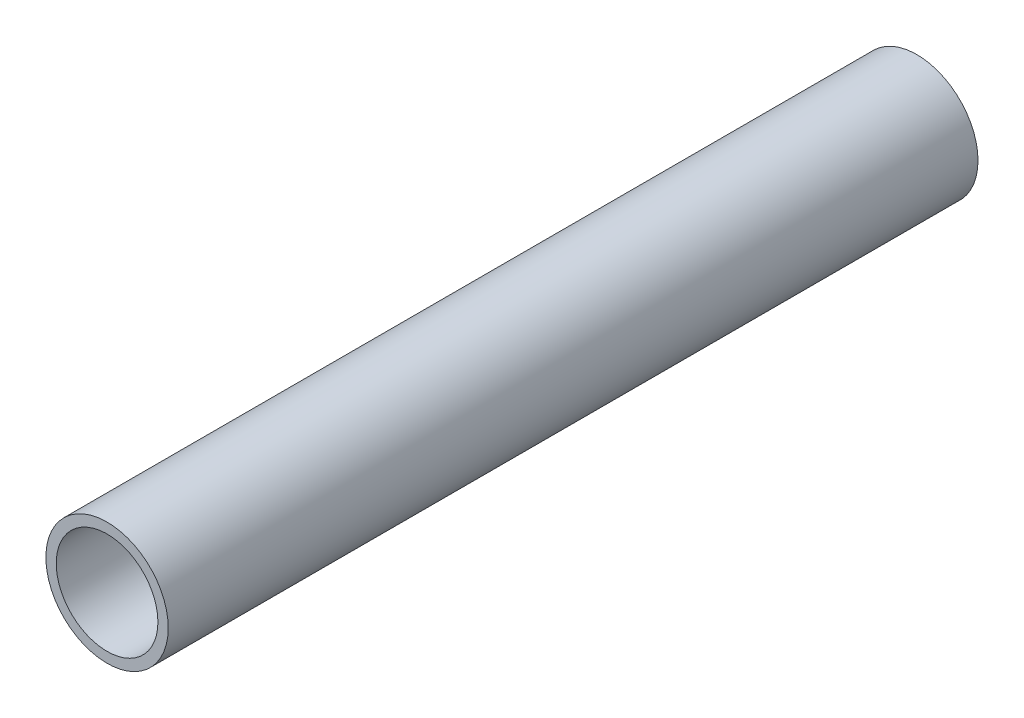
ISO-10303-21;
HEADER;
FILE_DESCRIPTION(('STEP AP214'),'2;1');
FILE_NAME('part.step','',(''),(''),'','','');
FILE_SCHEMA(('AUTOMOTIVE_DESIGN { 1 0 10303 214 1 1 1 1 }'));
ENDSEC;
DATA;
#1=APPLICATION_CONTEXT('core data for automotive mechanical design processes');
#2=APPLICATION_PROTOCOL_DEFINITION('international standard','automotive_design',2000,#1);
#3=PRODUCT_CONTEXT('',#1,'mechanical');
#4=PRODUCT('Part','Part','',(#3));
#5=PRODUCT_RELATED_PRODUCT_CATEGORY('part','',(#4));
#6=PRODUCT_DEFINITION_FORMATION('','',#4);
#7=PRODUCT_DEFINITION_CONTEXT('part definition',#1,'design');
#8=PRODUCT_DEFINITION('design','',#6,#7);
#9=PRODUCT_DEFINITION_SHAPE('','',#8);
#10=(LENGTH_UNIT() NAMED_UNIT(*) SI_UNIT(.MILLI.,.METRE.));
#11=(NAMED_UNIT(*) PLANE_ANGLE_UNIT() SI_UNIT($,.RADIAN.));
#12=(NAMED_UNIT(*) SI_UNIT($,.STERADIAN.) SOLID_ANGLE_UNIT());
#13=UNCERTAINTY_MEASURE_WITH_UNIT(LENGTH_MEASURE(1.E-05),#10,'distance_accuracy_value','');
#14=(GEOMETRIC_REPRESENTATION_CONTEXT(3) GLOBAL_UNCERTAINTY_ASSIGNED_CONTEXT((#13)) GLOBAL_UNIT_ASSIGNED_CONTEXT((#10,
#11,#12)) REPRESENTATION_CONTEXT('',''));
#15=CARTESIAN_POINT('',(0.,0.,0.));
#16=DIRECTION('',(0.,0.,1.));
#17=DIRECTION('',(1.,0.,0.));
#18=AXIS2_PLACEMENT_3D('',#15,#16,#17);
#19=CARTESIAN_POINT('',(0.,0.,75.6412));
#20=DIRECTION('',(0.,0.,1.));
#21=DIRECTION('',(1.,0.,0.));
#22=AXIS2_PLACEMENT_3D('',#19,#20,#21);
#23=PLANE('',#22);
#24=CARTESIAN_POINT('',(0.,0.,75.6412));
#25=DIRECTION('',(0.,0.,1.));
#26=DIRECTION('',(1.,0.,0.));
#27=AXIS2_PLACEMENT_3D('',#24,#25,#26);
#28=CIRCLE('',#27,5.715);
#29=CARTESIAN_POINT('',(5.715,0.,75.6412));
#30=VERTEX_POINT('',#29);
#31=EDGE_CURVE('E10',#30,#30,#28,.T.);
#32=ORIENTED_EDGE('',*,*,#31,.T.);
#33=EDGE_LOOP('',(#32));
#34=FACE_BOUND('',#33,.T.);
#35=CARTESIAN_POINT('',(0.,0.,75.6412));
#36=DIRECTION('',(0.,0.,1.));
#37=DIRECTION('',(1.,0.,0.));
#38=AXIS2_PLACEMENT_3D('',#35,#36,#37);
#39=CIRCLE('',#38,4.7498);
#40=CARTESIAN_POINT('',(4.7498,0.,75.6412));
#41=VERTEX_POINT('',#40);
#42=EDGE_CURVE('E46',#41,#41,#39,.T.);
#43=ORIENTED_EDGE('',*,*,#42,.F.);
#44=EDGE_LOOP('',(#43));
#45=FACE_BOUND('',#44,.T.);
#46=ADVANCED_FACE('F35',(#34,#45),#23,.T.);
#47=CARTESIAN_POINT('',(0.,0.,0.));
#48=DIRECTION('',(0.,0.,1.));
#49=DIRECTION('',(1.,0.,0.));
#50=AXIS2_PLACEMENT_3D('',#47,#48,#49);
#51=PLANE('',#50);
#52=CARTESIAN_POINT('',(0.,0.,0.));
#53=DIRECTION('',(0.,0.,1.));
#54=DIRECTION('',(1.,0.,0.));
#55=AXIS2_PLACEMENT_3D('',#52,#53,#54);
#56=CIRCLE('',#55,5.715);
#57=CARTESIAN_POINT('',(5.715,0.,0.));
#58=VERTEX_POINT('',#57);
#59=EDGE_CURVE('E39',#58,#58,#56,.T.);
#60=ORIENTED_EDGE('',*,*,#59,.F.);
#61=EDGE_LOOP('',(#60));
#62=FACE_BOUND('',#61,.T.);
#63=CARTESIAN_POINT('',(0.,0.,0.));
#64=DIRECTION('',(0.,0.,1.));
#65=DIRECTION('',(1.,0.,0.));
#66=AXIS2_PLACEMENT_3D('',#63,#64,#65);
#67=CIRCLE('',#66,4.7498);
#68=CARTESIAN_POINT('',(4.7498,0.,0.));
#69=VERTEX_POINT('',#68);
#70=EDGE_CURVE('E48',#69,#69,#67,.T.);
#71=ORIENTED_EDGE('',*,*,#70,.T.);
#72=EDGE_LOOP('',(#71));
#73=FACE_BOUND('',#72,.T.);
#74=ADVANCED_FACE('F58',(#62,#73),#51,.F.);
#75=CARTESIAN_POINT('',(0.,0.,75.6412));
#76=DIRECTION('',(0.,0.,-1.));
#77=DIRECTION('',(-1.,0.,0.));
#78=AXIS2_PLACEMENT_3D('',#75,#76,#77);
#79=CYLINDRICAL_SURFACE('',#78,5.715);
#80=ORIENTED_EDGE('',*,*,#31,.F.);
#81=EDGE_LOOP('',(#80));
#82=FACE_BOUND('',#81,.T.);
#83=ORIENTED_EDGE('',*,*,#59,.T.);
#84=EDGE_LOOP('',(#83));
#85=FACE_BOUND('',#84,.T.);
#86=ADVANCED_FACE('F37',(#82,#85),#79,.T.);
#87=CARTESIAN_POINT('',(0.,0.,75.6412));
#88=DIRECTION('',(0.,0.,-1.));
#89=DIRECTION('',(-1.,0.,0.));
#90=AXIS2_PLACEMENT_3D('',#87,#88,#89);
#91=CYLINDRICAL_SURFACE('',#90,4.7498);
#92=ORIENTED_EDGE('',*,*,#42,.T.);
#93=EDGE_LOOP('',(#92));
#94=FACE_BOUND('',#93,.T.);
#95=ORIENTED_EDGE('',*,*,#70,.F.);
#96=EDGE_LOOP('',(#95));
#97=FACE_BOUND('',#96,.T.);
#98=ADVANCED_FACE('F54',(#94,#97),#91,.F.);
#99=CLOSED_SHELL('',(#46,#74,#86,#98));
#100=MANIFOLD_SOLID_BREP('B2',#99);
#101=ADVANCED_BREP_SHAPE_REPRESENTATION('',(#18,#100),#14);
#102=SHAPE_DEFINITION_REPRESENTATION(#9,#101);
ENDSEC;
END-ISO-10303-21;
